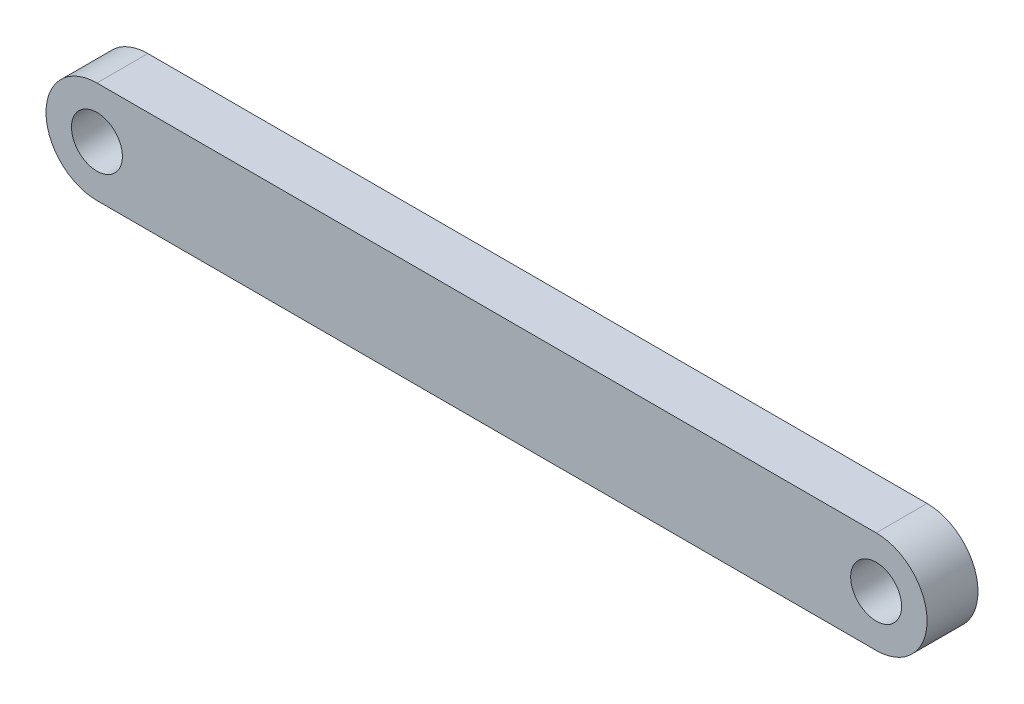
ISO-10303-21;
HEADER;
FILE_DESCRIPTION(('STEP AP214'),'2;1');
FILE_NAME('part.step','',(''),(''),'','','');
FILE_SCHEMA(('AUTOMOTIVE_DESIGN { 1 0 10303 214 1 1 1 1 }'));
ENDSEC;
DATA;
#1=APPLICATION_CONTEXT('core data for automotive mechanical design processes');
#2=APPLICATION_PROTOCOL_DEFINITION('international standard','automotive_design',2000,#1);
#3=PRODUCT_CONTEXT('',#1,'mechanical');
#4=PRODUCT('Part','Part','',(#3));
#5=PRODUCT_RELATED_PRODUCT_CATEGORY('part','',(#4));
#6=PRODUCT_DEFINITION_FORMATION('','',#4);
#7=PRODUCT_DEFINITION_CONTEXT('part definition',#1,'design');
#8=PRODUCT_DEFINITION('design','',#6,#7);
#9=PRODUCT_DEFINITION_SHAPE('','',#8);
#10=(LENGTH_UNIT() NAMED_UNIT(*) SI_UNIT(.MILLI.,.METRE.));
#11=(NAMED_UNIT(*) PLANE_ANGLE_UNIT() SI_UNIT($,.RADIAN.));
#12=(NAMED_UNIT(*) SI_UNIT($,.STERADIAN.) SOLID_ANGLE_UNIT());
#13=UNCERTAINTY_MEASURE_WITH_UNIT(LENGTH_MEASURE(1.E-05),#10,'distance_accuracy_value','');
#14=(GEOMETRIC_REPRESENTATION_CONTEXT(3) GLOBAL_UNCERTAINTY_ASSIGNED_CONTEXT((#13)) GLOBAL_UNIT_ASSIGNED_CONTEXT((#10,
#11,#12)) REPRESENTATION_CONTEXT('',''));
#15=CARTESIAN_POINT('',(0.,0.,0.));
#16=DIRECTION('',(0.,0.,1.));
#17=DIRECTION('',(1.,0.,0.));
#18=AXIS2_PLACEMENT_3D('',#15,#16,#17);
#19=CARTESIAN_POINT('',(0.,0.,10.));
#20=DIRECTION('',(0.,0.,1.));
#21=DIRECTION('',(1.,0.,0.));
#22=AXIS2_PLACEMENT_3D('',#19,#20,#21);
#23=PLANE('',#22);
#24=CARTESIAN_POINT('',(0.,0.,10.));
#25=DIRECTION('',(0.,0.,1.));
#26=DIRECTION('',(1.,0.,0.));
#27=AXIS2_PLACEMENT_3D('',#24,#25,#26);
#28=CIRCLE('',#27,5.);
#29=CARTESIAN_POINT('',(5.,0.,10.));
#30=VERTEX_POINT('',#29);
#31=EDGE_CURVE('E101',#30,#30,#28,.T.);
#32=ORIENTED_EDGE('',*,*,#31,.F.);
#33=EDGE_LOOP('',(#32));
#34=FACE_BOUND('',#33,.T.);
#35=CARTESIAN_POINT('',(0.,0.,10.));
#36=DIRECTION('',(0.,0.,1.));
#37=DIRECTION('',(1.,0.,0.));
#38=AXIS2_PLACEMENT_3D('',#35,#36,#37);
#39=CIRCLE('',#38,10.);
#40=CARTESIAN_POINT('',(0.,10.,10.));
#41=VERTEX_POINT('',#40);
#42=CARTESIAN_POINT('',(0.,-10.,10.));
#43=VERTEX_POINT('',#42);
#44=EDGE_CURVE('E86',#41,#43,#39,.T.);
#45=ORIENTED_EDGE('',*,*,#44,.T.);
#46=DIRECTION('',(1.,0.,0.));
#47=VECTOR('',#46,1.);
#48=CARTESIAN_POINT('',(0.,-10.,10.));
#49=LINE('',#48,#47);
#50=CARTESIAN_POINT('',(153.,-10.,10.));
#51=VERTEX_POINT('',#50);
#52=EDGE_CURVE('E81',#43,#51,#49,.T.);
#53=ORIENTED_EDGE('',*,*,#52,.T.);
#54=CARTESIAN_POINT('',(153.,0.,10.));
#55=DIRECTION('',(0.,0.,1.));
#56=DIRECTION('',(1.,0.,0.));
#57=AXIS2_PLACEMENT_3D('',#54,#55,#56);
#58=CIRCLE('',#57,10.);
#59=CARTESIAN_POINT('',(153.,10.,10.));
#60=VERTEX_POINT('',#59);
#61=EDGE_CURVE('E84',#51,#60,#58,.T.);
#62=ORIENTED_EDGE('',*,*,#61,.T.);
#63=DIRECTION('',(-1.,0.,0.));
#64=VECTOR('',#63,1.);
#65=CARTESIAN_POINT('',(0.,10.,10.));
#66=LINE('',#65,#64);
#67=EDGE_CURVE('E51',#60,#41,#66,.T.);
#68=ORIENTED_EDGE('',*,*,#67,.T.);
#69=EDGE_LOOP('',(#45,#53,#62,#68));
#70=FACE_BOUND('',#69,.T.);
#71=CARTESIAN_POINT('',(153.,0.,10.));
#72=DIRECTION('',(0.,0.,1.));
#73=DIRECTION('',(1.,0.,0.));
#74=AXIS2_PLACEMENT_3D('',#71,#72,#73);
#75=CIRCLE('',#74,4.99999999999999);
#76=CARTESIAN_POINT('',(158.,0.,10.));
#77=VERTEX_POINT('',#76);
#78=EDGE_CURVE('E116',#77,#77,#75,.T.);
#79=ORIENTED_EDGE('',*,*,#78,.F.);
#80=EDGE_LOOP('',(#79));
#81=FACE_BOUND('',#80,.T.);
#82=ADVANCED_FACE('F34',(#34,#70,#81),#23,.T.);
#83=CARTESIAN_POINT('',(0.,0.,0.));
#84=DIRECTION('',(0.,0.,1.));
#85=DIRECTION('',(1.,0.,0.));
#86=AXIS2_PLACEMENT_3D('',#83,#84,#85);
#87=PLANE('',#86);
#88=CARTESIAN_POINT('',(0.,0.,0.));
#89=DIRECTION('',(0.,0.,1.));
#90=DIRECTION('',(1.,0.,0.));
#91=AXIS2_PLACEMENT_3D('',#88,#89,#90);
#92=CIRCLE('',#91,10.);
#93=CARTESIAN_POINT('',(0.,10.,0.));
#94=VERTEX_POINT('',#93);
#95=CARTESIAN_POINT('',(0.,-10.,0.));
#96=VERTEX_POINT('',#95);
#97=EDGE_CURVE('E98',#94,#96,#92,.T.);
#98=ORIENTED_EDGE('',*,*,#97,.F.);
#99=DIRECTION('',(-1.,0.,0.));
#100=VECTOR('',#99,1.);
#101=CARTESIAN_POINT('',(0.,10.,0.));
#102=LINE('',#101,#100);
#103=CARTESIAN_POINT('',(153.,10.,0.));
#104=VERTEX_POINT('',#103);
#105=EDGE_CURVE('E74',#104,#94,#102,.T.);
#106=ORIENTED_EDGE('',*,*,#105,.F.);
#107=CARTESIAN_POINT('',(153.,0.,0.));
#108=DIRECTION('',(0.,0.,1.));
#109=DIRECTION('',(1.,0.,0.));
#110=AXIS2_PLACEMENT_3D('',#107,#108,#109);
#111=CIRCLE('',#110,10.);
#112=CARTESIAN_POINT('',(153.,-10.,0.));
#113=VERTEX_POINT('',#112);
#114=EDGE_CURVE('E68',#113,#104,#111,.T.);
#115=ORIENTED_EDGE('',*,*,#114,.F.);
#116=DIRECTION('',(1.,0.,0.));
#117=VECTOR('',#116,1.);
#118=CARTESIAN_POINT('',(0.,-10.,0.));
#119=LINE('',#118,#117);
#120=EDGE_CURVE('E90',#96,#113,#119,.T.);
#121=ORIENTED_EDGE('',*,*,#120,.F.);
#122=EDGE_LOOP('',(#98,#106,#115,#121));
#123=FACE_BOUND('',#122,.T.);
#124=CARTESIAN_POINT('',(0.,0.,0.));
#125=DIRECTION('',(0.,0.,1.));
#126=DIRECTION('',(1.,0.,0.));
#127=AXIS2_PLACEMENT_3D('',#124,#125,#126);
#128=CIRCLE('',#127,5.);
#129=CARTESIAN_POINT('',(5.,0.,0.));
#130=VERTEX_POINT('',#129);
#131=EDGE_CURVE('E113',#130,#130,#128,.T.);
#132=ORIENTED_EDGE('',*,*,#131,.T.);
#133=EDGE_LOOP('',(#132));
#134=FACE_BOUND('',#133,.T.);
#135=CARTESIAN_POINT('',(153.,0.,0.));
#136=DIRECTION('',(0.,0.,1.));
#137=DIRECTION('',(1.,0.,0.));
#138=AXIS2_PLACEMENT_3D('',#135,#136,#137);
#139=CIRCLE('',#138,4.99999999999999);
#140=CARTESIAN_POINT('',(158.,0.,0.));
#141=VERTEX_POINT('',#140);
#142=EDGE_CURVE('E119',#141,#141,#139,.T.);
#143=ORIENTED_EDGE('',*,*,#142,.T.);
#144=EDGE_LOOP('',(#143));
#145=FACE_BOUND('',#144,.T.);
#146=ADVANCED_FACE('F109',(#123,#134,#145),#87,.F.);
#147=CARTESIAN_POINT('',(0.,0.,10.));
#148=DIRECTION('',(0.,0.,-1.));
#149=DIRECTION('',(-1.,0.,0.));
#150=AXIS2_PLACEMENT_3D('',#147,#148,#149);
#151=CYLINDRICAL_SURFACE('',#150,10.);
#152=ORIENTED_EDGE('',*,*,#97,.T.);
#153=DIRECTION('',(0.,0.,-1.));
#154=VECTOR('',#153,1.);
#155=CARTESIAN_POINT('',(0.,-10.,10.));
#156=LINE('',#155,#154);
#157=EDGE_CURVE('E11',#43,#96,#156,.T.);
#158=ORIENTED_EDGE('',*,*,#157,.F.);
#159=ORIENTED_EDGE('',*,*,#44,.F.);
#160=DIRECTION('',(0.,0.,-1.));
#161=VECTOR('',#160,1.);
#162=CARTESIAN_POINT('',(0.,10.,10.));
#163=LINE('',#162,#161);
#164=EDGE_CURVE('E94',#41,#94,#163,.T.);
#165=ORIENTED_EDGE('',*,*,#164,.T.);
#166=EDGE_LOOP('',(#152,#158,#159,#165));
#167=FACE_BOUND('',#166,.T.);
#168=ADVANCED_FACE('F36',(#167),#151,.T.);
#169=CARTESIAN_POINT('',(0.,-10.,10.));
#170=DIRECTION('',(0.,1.,0.));
#171=DIRECTION('',(0.,0.,1.));
#172=AXIS2_PLACEMENT_3D('',#169,#170,#171);
#173=PLANE('',#172);
#174=ORIENTED_EDGE('',*,*,#120,.T.);
#175=DIRECTION('',(0.,0.,-1.));
#176=VECTOR('',#175,1.);
#177=CARTESIAN_POINT('',(153.,-10.,10.));
#178=LINE('',#177,#176);
#179=EDGE_CURVE('E43',#51,#113,#178,.T.);
#180=ORIENTED_EDGE('',*,*,#179,.F.);
#181=ORIENTED_EDGE('',*,*,#52,.F.);
#182=ORIENTED_EDGE('',*,*,#157,.T.);
#183=EDGE_LOOP('',(#174,#180,#181,#182));
#184=FACE_BOUND('',#183,.T.);
#185=ADVANCED_FACE('F89',(#184),#173,.F.);
#186=CARTESIAN_POINT('',(153.,0.,10.));
#187=DIRECTION('',(0.,0.,-1.));
#188=DIRECTION('',(-1.,0.,0.));
#189=AXIS2_PLACEMENT_3D('',#186,#187,#188);
#190=CYLINDRICAL_SURFACE('',#189,10.);
#191=ORIENTED_EDGE('',*,*,#114,.T.);
#192=DIRECTION('',(0.,0.,-1.));
#193=VECTOR('',#192,1.);
#194=CARTESIAN_POINT('',(153.,10.,10.));
#195=LINE('',#194,#193);
#196=EDGE_CURVE('E91',#60,#104,#195,.T.);
#197=ORIENTED_EDGE('',*,*,#196,.F.);
#198=ORIENTED_EDGE('',*,*,#61,.F.);
#199=ORIENTED_EDGE('',*,*,#179,.T.);
#200=EDGE_LOOP('',(#191,#197,#198,#199));
#201=FACE_BOUND('',#200,.T.);
#202=ADVANCED_FACE('F92',(#201),#190,.T.);
#203=CARTESIAN_POINT('',(0.,10.,10.));
#204=DIRECTION('',(0.,-1.,0.));
#205=DIRECTION('',(0.,0.,-1.));
#206=AXIS2_PLACEMENT_3D('',#203,#204,#205);
#207=PLANE('',#206);
#208=ORIENTED_EDGE('',*,*,#105,.T.);
#209=ORIENTED_EDGE('',*,*,#164,.F.);
#210=ORIENTED_EDGE('',*,*,#67,.F.);
#211=ORIENTED_EDGE('',*,*,#196,.T.);
#212=EDGE_LOOP('',(#208,#209,#210,#211));
#213=FACE_BOUND('',#212,.T.);
#214=ADVANCED_FACE('F106',(#213),#207,.F.);
#215=CARTESIAN_POINT('',(0.,0.,10.));
#216=DIRECTION('',(0.,0.,-1.));
#217=DIRECTION('',(-1.,0.,0.));
#218=AXIS2_PLACEMENT_3D('',#215,#216,#217);
#219=CYLINDRICAL_SURFACE('',#218,5.);
#220=ORIENTED_EDGE('',*,*,#31,.T.);
#221=EDGE_LOOP('',(#220));
#222=FACE_BOUND('',#221,.T.);
#223=ORIENTED_EDGE('',*,*,#131,.F.);
#224=EDGE_LOOP('',(#223));
#225=FACE_BOUND('',#224,.T.);
#226=ADVANCED_FACE('F136',(#222,#225),#219,.F.);
#227=CARTESIAN_POINT('',(153.,0.,10.));
#228=DIRECTION('',(0.,0.,-1.));
#229=DIRECTION('',(-1.,0.,0.));
#230=AXIS2_PLACEMENT_3D('',#227,#228,#229);
#231=CYLINDRICAL_SURFACE('',#230,4.99999999999999);
#232=ORIENTED_EDGE('',*,*,#78,.T.);
#233=EDGE_LOOP('',(#232));
#234=FACE_BOUND('',#233,.T.);
#235=ORIENTED_EDGE('',*,*,#142,.F.);
#236=EDGE_LOOP('',(#235));
#237=FACE_BOUND('',#236,.T.);
#238=ADVANCED_FACE('F125',(#234,#237),#231,.F.);
#239=CLOSED_SHELL('',(#82,#146,#168,#185,#202,#214,#226,#238));
#240=MANIFOLD_SOLID_BREP('B2',#239);
#241=ADVANCED_BREP_SHAPE_REPRESENTATION('',(#18,#240),#14);
#242=SHAPE_DEFINITION_REPRESENTATION(#9,#241);
ENDSEC;
END-ISO-10303-21;
